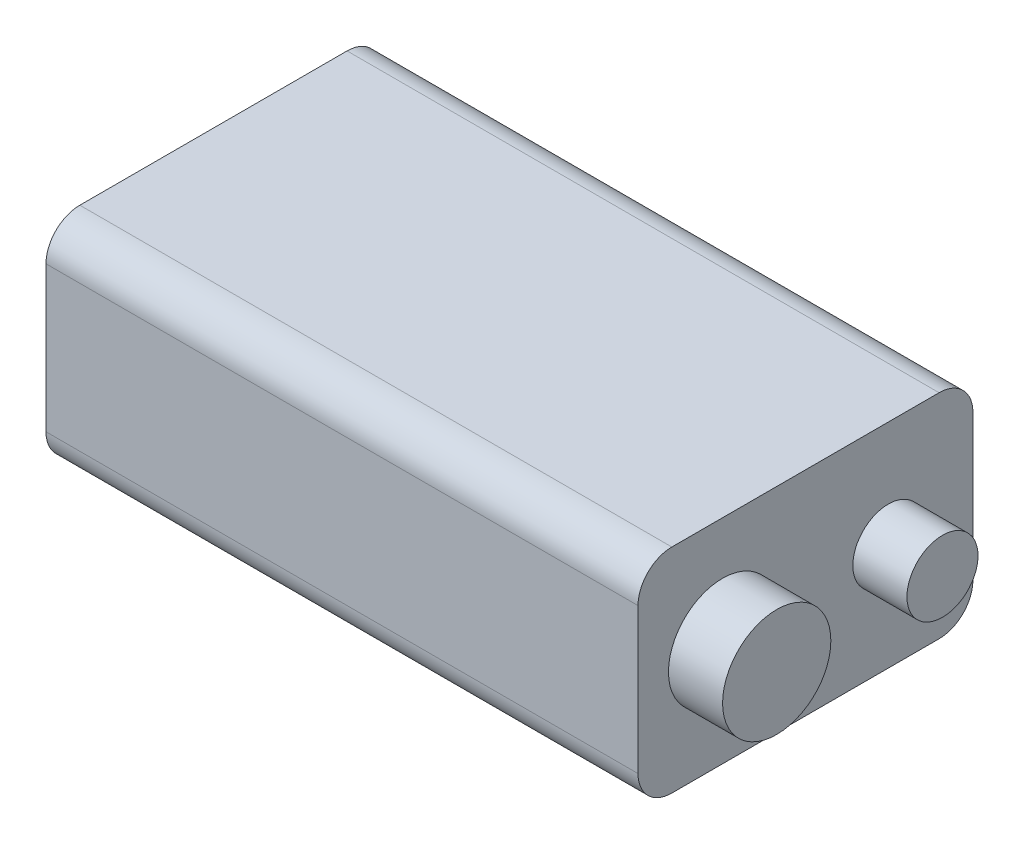
ISO-10303-21;
HEADER;
FILE_DESCRIPTION(('STEP AP214'),'2;1');
FILE_NAME('part.step','',(''),(''),'','','');
FILE_SCHEMA(('AUTOMOTIVE_DESIGN { 1 0 10303 214 1 1 1 1 }'));
ENDSEC;
DATA;
#1=APPLICATION_CONTEXT('core data for automotive mechanical design processes');
#2=APPLICATION_PROTOCOL_DEFINITION('international standard','automotive_design',2000,#1);
#3=PRODUCT_CONTEXT('',#1,'mechanical');
#4=PRODUCT('Part','Part','',(#3));
#5=PRODUCT_RELATED_PRODUCT_CATEGORY('part','',(#4));
#6=PRODUCT_DEFINITION_FORMATION('','',#4);
#7=PRODUCT_DEFINITION_CONTEXT('part definition',#1,'design');
#8=PRODUCT_DEFINITION('design','',#6,#7);
#9=PRODUCT_DEFINITION_SHAPE('','',#8);
#10=(LENGTH_UNIT() NAMED_UNIT(*) SI_UNIT(.MILLI.,.METRE.));
#11=(NAMED_UNIT(*) PLANE_ANGLE_UNIT() SI_UNIT($,.RADIAN.));
#12=(NAMED_UNIT(*) SI_UNIT($,.STERADIAN.) SOLID_ANGLE_UNIT());
#13=UNCERTAINTY_MEASURE_WITH_UNIT(LENGTH_MEASURE(1.E-05),#10,'distance_accuracy_value','');
#14=(GEOMETRIC_REPRESENTATION_CONTEXT(3) GLOBAL_UNCERTAINTY_ASSIGNED_CONTEXT((#13)) GLOBAL_UNIT_ASSIGNED_CONTEXT((#10,
#11,#12)) REPRESENTATION_CONTEXT('',''));
#15=CARTESIAN_POINT('',(0.,0.,0.));
#16=DIRECTION('',(0.,0.,1.));
#17=DIRECTION('',(1.,0.,0.));
#18=AXIS2_PLACEMENT_3D('',#15,#16,#17);
#19=CARTESIAN_POINT('',(22.225,16.002,-12.573));
#20=DIRECTION('',(-1.,0.,0.));
#21=DIRECTION('',(0.,0.,1.));
#22=AXIS2_PLACEMENT_3D('',#19,#20,#21);
#23=PLANE('',#22);
#24=CARTESIAN_POINT('',(22.225,8.001,-6.223));
#25=DIRECTION('',(-1.,0.,0.));
#26=DIRECTION('',(0.,0.,1.));
#27=AXIS2_PLACEMENT_3D('',#24,#25,#26);
#28=CIRCLE('',#27,2.667);
#29=CARTESIAN_POINT('',(22.225,8.001,-3.556));
#30=VERTEX_POINT('',#29);
#31=EDGE_CURVE('E11',#30,#30,#28,.F.);
#32=ORIENTED_EDGE('',*,*,#31,.F.);
#33=EDGE_LOOP('',(#32));
#34=FACE_BOUND('',#33,.T.);
#35=CARTESIAN_POINT('',(22.225,8.001,6.223));
#36=DIRECTION('',(-1.,0.,0.));
#37=DIRECTION('',(0.,0.,1.));
#38=AXIS2_PLACEMENT_3D('',#35,#36,#37);
#39=CIRCLE('',#38,4.064);
#40=CARTESIAN_POINT('',(22.225,8.001,10.287));
#41=VERTEX_POINT('',#40);
#42=EDGE_CURVE('E41',#41,#41,#39,.F.);
#43=ORIENTED_EDGE('',*,*,#42,.F.);
#44=EDGE_LOOP('',(#43));
#45=FACE_BOUND('',#44,.T.);
#46=DIRECTION('',(0.,0.,-1.));
#47=VECTOR('',#46,1.);
#48=CARTESIAN_POINT('',(22.225,0.,-12.573));
#49=LINE('',#48,#47);
#50=CARTESIAN_POINT('',(22.225,0.,10.033));
#51=VERTEX_POINT('',#50);
#52=CARTESIAN_POINT('',(22.225,0.,-10.033));
#53=VERTEX_POINT('',#52);
#54=EDGE_CURVE('E162',#51,#53,#49,.T.);
#55=ORIENTED_EDGE('',*,*,#54,.T.);
#56=CARTESIAN_POINT('',(22.225,2.54,-10.033));
#57=DIRECTION('',(-1.,0.,0.));
#58=DIRECTION('',(0.,0.,1.));
#59=AXIS2_PLACEMENT_3D('',#56,#57,#58);
#60=CIRCLE('',#59,2.54);
#61=CARTESIAN_POINT('',(22.225,2.54,-12.573));
#62=VERTEX_POINT('',#61);
#63=EDGE_CURVE('E142',#53,#62,#60,.F.);
#64=ORIENTED_EDGE('',*,*,#63,.T.);
#65=DIRECTION('',(0.,-1.,0.));
#66=VECTOR('',#65,1.);
#67=CARTESIAN_POINT('',(22.225,16.002,-12.573));
#68=LINE('',#67,#66);
#69=CARTESIAN_POINT('',(22.225,13.462,-12.573));
#70=VERTEX_POINT('',#69);
#71=EDGE_CURVE('E121',#70,#62,#68,.T.);
#72=ORIENTED_EDGE('',*,*,#71,.F.);
#73=CARTESIAN_POINT('',(22.225,13.462,-10.033));
#74=DIRECTION('',(-1.,0.,0.));
#75=DIRECTION('',(0.,0.,1.));
#76=AXIS2_PLACEMENT_3D('',#73,#74,#75);
#77=CIRCLE('',#76,2.54);
#78=CARTESIAN_POINT('',(22.225,16.002,-10.033));
#79=VERTEX_POINT('',#78);
#80=EDGE_CURVE('E126',#70,#79,#77,.F.);
#81=ORIENTED_EDGE('',*,*,#80,.T.);
#82=DIRECTION('',(0.,0.,-1.));
#83=VECTOR('',#82,1.);
#84=CARTESIAN_POINT('',(22.225,16.002,-12.573));
#85=LINE('',#84,#83);
#86=CARTESIAN_POINT('',(22.225,16.002,10.033));
#87=VERTEX_POINT('',#86);
#88=EDGE_CURVE('E175',#87,#79,#85,.T.);
#89=ORIENTED_EDGE('',*,*,#88,.F.);
#90=CARTESIAN_POINT('',(22.225,13.462,10.033));
#91=DIRECTION('',(-1.,0.,0.));
#92=DIRECTION('',(0.,0.,1.));
#93=AXIS2_PLACEMENT_3D('',#90,#91,#92);
#94=CIRCLE('',#93,2.54);
#95=CARTESIAN_POINT('',(22.225,13.462,12.573));
#96=VERTEX_POINT('',#95);
#97=EDGE_CURVE('E56',#87,#96,#94,.F.);
#98=ORIENTED_EDGE('',*,*,#97,.T.);
#99=DIRECTION('',(0.,-1.,0.));
#100=VECTOR('',#99,1.);
#101=CARTESIAN_POINT('',(22.225,16.002,12.573));
#102=LINE('',#101,#100);
#103=CARTESIAN_POINT('',(22.225,2.54,12.573));
#104=VERTEX_POINT('',#103);
#105=EDGE_CURVE('E181',#96,#104,#102,.T.);
#106=ORIENTED_EDGE('',*,*,#105,.T.);
#107=CARTESIAN_POINT('',(22.225,2.54,10.033));
#108=DIRECTION('',(-1.,0.,0.));
#109=DIRECTION('',(0.,0.,1.));
#110=AXIS2_PLACEMENT_3D('',#107,#108,#109);
#111=CIRCLE('',#110,2.54);
#112=EDGE_CURVE('E48',#104,#51,#111,.F.);
#113=ORIENTED_EDGE('',*,*,#112,.T.);
#114=EDGE_LOOP('',(#55,#64,#72,#81,#89,#98,#106,#113));
#115=FACE_BOUND('',#114,.T.);
#116=ADVANCED_FACE('F33',(#34,#45,#115),#23,.F.);
#117=CARTESIAN_POINT('',(-22.225,16.002,-12.573));
#118=DIRECTION('',(0.,0.,1.));
#119=DIRECTION('',(1.,0.,0.));
#120=AXIS2_PLACEMENT_3D('',#117,#118,#119);
#121=PLANE('',#120);
#122=ORIENTED_EDGE('',*,*,#71,.T.);
#123=DIRECTION('',(-1.,0.,0.));
#124=VECTOR('',#123,1.);
#125=CARTESIAN_POINT('',(-22.225,2.54,-12.573));
#126=LINE('',#125,#124);
#127=CARTESIAN_POINT('',(-22.225,2.54,-12.573));
#128=VERTEX_POINT('',#127);
#129=EDGE_CURVE('E120',#62,#128,#126,.T.);
#130=ORIENTED_EDGE('',*,*,#129,.T.);
#131=DIRECTION('',(0.,-1.,0.));
#132=VECTOR('',#131,1.);
#133=CARTESIAN_POINT('',(-22.225,16.002,-12.573));
#134=LINE('',#133,#132);
#135=CARTESIAN_POINT('',(-22.225,13.462,-12.573));
#136=VERTEX_POINT('',#135);
#137=EDGE_CURVE('E103',#136,#128,#134,.T.);
#138=ORIENTED_EDGE('',*,*,#137,.F.);
#139=DIRECTION('',(-1.,0.,0.));
#140=VECTOR('',#139,1.);
#141=CARTESIAN_POINT('',(22.225,13.462,-12.573));
#142=LINE('',#141,#140);
#143=EDGE_CURVE('E117',#136,#70,#142,.F.);
#144=ORIENTED_EDGE('',*,*,#143,.T.);
#145=EDGE_LOOP('',(#122,#130,#138,#144));
#146=FACE_BOUND('',#145,.T.);
#147=ADVANCED_FACE('F116',(#146),#121,.F.);
#148=CARTESIAN_POINT('',(-22.225,16.002,-12.573));
#149=DIRECTION('',(1.,0.,0.));
#150=DIRECTION('',(0.,0.,-1.));
#151=AXIS2_PLACEMENT_3D('',#148,#149,#150);
#152=PLANE('',#151);
#153=ORIENTED_EDGE('',*,*,#137,.T.);
#154=CARTESIAN_POINT('',(-22.225,2.54,-10.033));
#155=DIRECTION('',(1.,0.,0.));
#156=DIRECTION('',(0.,0.,-1.));
#157=AXIS2_PLACEMENT_3D('',#154,#155,#156);
#158=CIRCLE('',#157,2.54);
#159=CARTESIAN_POINT('',(-22.225,0.,-10.033));
#160=VERTEX_POINT('',#159);
#161=EDGE_CURVE('E133',#128,#160,#158,.F.);
#162=ORIENTED_EDGE('',*,*,#161,.T.);
#163=DIRECTION('',(0.,0.,1.));
#164=VECTOR('',#163,1.);
#165=CARTESIAN_POINT('',(-22.225,0.,-12.573));
#166=LINE('',#165,#164);
#167=CARTESIAN_POINT('',(-22.225,0.,10.033));
#168=VERTEX_POINT('',#167);
#169=EDGE_CURVE('E165',#160,#168,#166,.T.);
#170=ORIENTED_EDGE('',*,*,#169,.T.);
#171=CARTESIAN_POINT('',(-22.225,2.54,10.033));
#172=DIRECTION('',(1.,0.,0.));
#173=DIRECTION('',(0.,0.,-1.));
#174=AXIS2_PLACEMENT_3D('',#171,#172,#173);
#175=CIRCLE('',#174,2.54);
#176=CARTESIAN_POINT('',(-22.225,2.54,12.573));
#177=VERTEX_POINT('',#176);
#178=EDGE_CURVE('E110',#168,#177,#175,.F.);
#179=ORIENTED_EDGE('',*,*,#178,.T.);
#180=DIRECTION('',(0.,-1.,0.));
#181=VECTOR('',#180,1.);
#182=CARTESIAN_POINT('',(-22.225,16.002,12.573));
#183=LINE('',#182,#181);
#184=CARTESIAN_POINT('',(-22.225,13.462,12.573));
#185=VERTEX_POINT('',#184);
#186=EDGE_CURVE('E122',#185,#177,#183,.T.);
#187=ORIENTED_EDGE('',*,*,#186,.F.);
#188=CARTESIAN_POINT('',(-22.225,13.462,10.033));
#189=DIRECTION('',(1.,0.,0.));
#190=DIRECTION('',(0.,0.,-1.));
#191=AXIS2_PLACEMENT_3D('',#188,#189,#190);
#192=CIRCLE('',#191,2.54);
#193=CARTESIAN_POINT('',(-22.225,16.002,10.033));
#194=VERTEX_POINT('',#193);
#195=EDGE_CURVE('E111',#185,#194,#192,.F.);
#196=ORIENTED_EDGE('',*,*,#195,.T.);
#197=DIRECTION('',(0.,0.,1.));
#198=VECTOR('',#197,1.);
#199=CARTESIAN_POINT('',(-22.225,16.002,-12.573));
#200=LINE('',#199,#198);
#201=CARTESIAN_POINT('',(-22.225,16.002,-10.033));
#202=VERTEX_POINT('',#201);
#203=EDGE_CURVE('E105',#202,#194,#200,.T.);
#204=ORIENTED_EDGE('',*,*,#203,.F.);
#205=CARTESIAN_POINT('',(-22.225,13.462,-10.033));
#206=DIRECTION('',(1.,0.,0.));
#207=DIRECTION('',(0.,0.,-1.));
#208=AXIS2_PLACEMENT_3D('',#205,#206,#207);
#209=CIRCLE('',#208,2.54);
#210=EDGE_CURVE('E100',#202,#136,#209,.F.);
#211=ORIENTED_EDGE('',*,*,#210,.T.);
#212=EDGE_LOOP('',(#153,#162,#170,#179,#187,#196,#204,#211));
#213=FACE_BOUND('',#212,.T.);
#214=ADVANCED_FACE('F102',(#213),#152,.F.);
#215=CARTESIAN_POINT('',(-22.225,16.002,12.573));
#216=DIRECTION('',(0.,0.,-1.));
#217=DIRECTION('',(-1.,0.,0.));
#218=AXIS2_PLACEMENT_3D('',#215,#216,#217);
#219=PLANE('',#218);
#220=ORIENTED_EDGE('',*,*,#186,.T.);
#221=DIRECTION('',(1.,0.,0.));
#222=VECTOR('',#221,1.);
#223=CARTESIAN_POINT('',(-22.225,2.54,12.573));
#224=LINE('',#223,#222);
#225=EDGE_CURVE('E146',#177,#104,#224,.T.);
#226=ORIENTED_EDGE('',*,*,#225,.T.);
#227=ORIENTED_EDGE('',*,*,#105,.F.);
#228=DIRECTION('',(1.,0.,0.));
#229=VECTOR('',#228,1.);
#230=CARTESIAN_POINT('',(-22.225,13.462,12.573));
#231=LINE('',#230,#229);
#232=EDGE_CURVE('E144',#96,#185,#231,.F.);
#233=ORIENTED_EDGE('',*,*,#232,.T.);
#234=EDGE_LOOP('',(#220,#226,#227,#233));
#235=FACE_BOUND('',#234,.T.);
#236=ADVANCED_FACE('F186',(#235),#219,.F.);
#237=CARTESIAN_POINT('',(0.,16.002,0.));
#238=DIRECTION('',(0.,1.,0.));
#239=DIRECTION('',(0.,0.,1.));
#240=AXIS2_PLACEMENT_3D('',#237,#238,#239);
#241=PLANE('',#240);
#242=ORIENTED_EDGE('',*,*,#88,.T.);
#243=DIRECTION('',(-1.,0.,0.));
#244=VECTOR('',#243,1.);
#245=CARTESIAN_POINT('',(-22.225,16.002,-10.033));
#246=LINE('',#245,#244);
#247=EDGE_CURVE('E151',#79,#202,#246,.T.);
#248=ORIENTED_EDGE('',*,*,#247,.T.);
#249=ORIENTED_EDGE('',*,*,#203,.T.);
#250=DIRECTION('',(1.,0.,0.));
#251=VECTOR('',#250,1.);
#252=CARTESIAN_POINT('',(22.225,16.002,10.033));
#253=LINE('',#252,#251);
#254=EDGE_CURVE('E148',#194,#87,#253,.T.);
#255=ORIENTED_EDGE('',*,*,#254,.T.);
#256=EDGE_LOOP('',(#242,#248,#249,#255));
#257=FACE_BOUND('',#256,.T.);
#258=ADVANCED_FACE('F204',(#257),#241,.T.);
#259=CARTESIAN_POINT('',(0.,0.,0.));
#260=DIRECTION('',(0.,1.,0.));
#261=DIRECTION('',(0.,0.,1.));
#262=AXIS2_PLACEMENT_3D('',#259,#260,#261);
#263=PLANE('',#262);
#264=ORIENTED_EDGE('',*,*,#169,.F.);
#265=DIRECTION('',(-1.,0.,0.));
#266=VECTOR('',#265,1.);
#267=CARTESIAN_POINT('',(0.,0.,-10.033));
#268=LINE('',#267,#266);
#269=EDGE_CURVE('E137',#160,#53,#268,.F.);
#270=ORIENTED_EDGE('',*,*,#269,.T.);
#271=ORIENTED_EDGE('',*,*,#54,.F.);
#272=DIRECTION('',(1.,0.,0.));
#273=VECTOR('',#272,1.);
#274=CARTESIAN_POINT('',(0.,0.,10.033));
#275=LINE('',#274,#273);
#276=EDGE_CURVE('E135',#51,#168,#275,.F.);
#277=ORIENTED_EDGE('',*,*,#276,.T.);
#278=EDGE_LOOP('',(#264,#270,#271,#277));
#279=FACE_BOUND('',#278,.T.);
#280=ADVANCED_FACE('F174',(#279),#263,.F.);
#281=CARTESIAN_POINT('',(-22.225,2.54,-10.033));
#282=DIRECTION('',(-1.,0.,0.));
#283=DIRECTION('',(0.,0.,1.));
#284=AXIS2_PLACEMENT_3D('',#281,#282,#283);
#285=CYLINDRICAL_SURFACE('',#284,2.54);
#286=ORIENTED_EDGE('',*,*,#63,.F.);
#287=ORIENTED_EDGE('',*,*,#269,.F.);
#288=ORIENTED_EDGE('',*,*,#161,.F.);
#289=ORIENTED_EDGE('',*,*,#129,.F.);
#290=EDGE_LOOP('',(#286,#287,#288,#289));
#291=FACE_BOUND('',#290,.T.);
#292=ADVANCED_FACE('F170',(#291),#285,.T.);
#293=CARTESIAN_POINT('',(-22.225,2.54,10.033));
#294=DIRECTION('',(1.,0.,0.));
#295=DIRECTION('',(0.,0.,-1.));
#296=AXIS2_PLACEMENT_3D('',#293,#294,#295);
#297=CYLINDRICAL_SURFACE('',#296,2.54);
#298=ORIENTED_EDGE('',*,*,#178,.F.);
#299=ORIENTED_EDGE('',*,*,#276,.F.);
#300=ORIENTED_EDGE('',*,*,#112,.F.);
#301=ORIENTED_EDGE('',*,*,#225,.F.);
#302=EDGE_LOOP('',(#298,#299,#300,#301));
#303=FACE_BOUND('',#302,.T.);
#304=ADVANCED_FACE('F189',(#303),#297,.T.);
#305=CARTESIAN_POINT('',(0.,13.462,-10.033));
#306=DIRECTION('',(1.,0.,0.));
#307=DIRECTION('',(0.,0.,-1.));
#308=AXIS2_PLACEMENT_3D('',#305,#306,#307);
#309=CYLINDRICAL_SURFACE('',#308,2.54);
#310=ORIENTED_EDGE('',*,*,#80,.F.);
#311=ORIENTED_EDGE('',*,*,#143,.F.);
#312=ORIENTED_EDGE('',*,*,#210,.F.);
#313=ORIENTED_EDGE('',*,*,#247,.F.);
#314=EDGE_LOOP('',(#310,#311,#312,#313));
#315=FACE_BOUND('',#314,.T.);
#316=ADVANCED_FACE('F125',(#315),#309,.T.);
#317=CARTESIAN_POINT('',(0.,13.462,10.033));
#318=DIRECTION('',(-1.,0.,0.));
#319=DIRECTION('',(0.,0.,1.));
#320=AXIS2_PLACEMENT_3D('',#317,#318,#319);
#321=CYLINDRICAL_SURFACE('',#320,2.54);
#322=ORIENTED_EDGE('',*,*,#195,.F.);
#323=ORIENTED_EDGE('',*,*,#232,.F.);
#324=ORIENTED_EDGE('',*,*,#97,.F.);
#325=ORIENTED_EDGE('',*,*,#254,.F.);
#326=EDGE_LOOP('',(#322,#323,#324,#325));
#327=FACE_BOUND('',#326,.T.);
#328=ADVANCED_FACE('F35',(#327),#321,.T.);
#329=CARTESIAN_POINT('',(26.289,8.001,6.223));
#330=DIRECTION('',(-1.,0.,0.));
#331=DIRECTION('',(0.,0.,1.));
#332=AXIS2_PLACEMENT_3D('',#329,#330,#331);
#333=CYLINDRICAL_SURFACE('',#332,4.064);
#334=CARTESIAN_POINT('',(26.289,8.001,6.223));
#335=DIRECTION('',(1.,0.,0.));
#336=DIRECTION('',(0.,0.,-1.));
#337=AXIS2_PLACEMENT_3D('',#334,#335,#336);
#338=CIRCLE('',#337,4.064);
#339=CARTESIAN_POINT('',(26.289,8.001,2.159));
#340=VERTEX_POINT('',#339);
#341=EDGE_CURVE('E166',#340,#340,#338,.T.);
#342=ORIENTED_EDGE('',*,*,#341,.F.);
#343=EDGE_LOOP('',(#342));
#344=FACE_BOUND('',#343,.T.);
#345=ORIENTED_EDGE('',*,*,#42,.T.);
#346=EDGE_LOOP('',(#345));
#347=FACE_BOUND('',#346,.T.);
#348=ADVANCED_FACE('F155',(#344,#347),#333,.T.);
#349=CARTESIAN_POINT('',(26.289,8.001,6.223));
#350=DIRECTION('',(1.,0.,0.));
#351=DIRECTION('',(0.,0.,-1.));
#352=AXIS2_PLACEMENT_3D('',#349,#350,#351);
#353=PLANE('',#352);
#354=ORIENTED_EDGE('',*,*,#341,.T.);
#355=EDGE_LOOP('',(#354));
#356=FACE_BOUND('',#355,.T.);
#357=ADVANCED_FACE('F212',(#356),#353,.T.);
#358=CARTESIAN_POINT('',(26.289,8.001,-6.223));
#359=DIRECTION('',(-1.,0.,0.));
#360=DIRECTION('',(0.,0.,1.));
#361=AXIS2_PLACEMENT_3D('',#358,#359,#360);
#362=CYLINDRICAL_SURFACE('',#361,2.667);
#363=CARTESIAN_POINT('',(26.289,8.001,-6.223));
#364=DIRECTION('',(1.,0.,0.));
#365=DIRECTION('',(0.,0.,-1.));
#366=AXIS2_PLACEMENT_3D('',#363,#364,#365);
#367=CIRCLE('',#366,2.667);
#368=CARTESIAN_POINT('',(26.289,8.001,-8.89));
#369=VERTEX_POINT('',#368);
#370=EDGE_CURVE('E228',#369,#369,#367,.T.);
#371=ORIENTED_EDGE('',*,*,#370,.F.);
#372=EDGE_LOOP('',(#371));
#373=FACE_BOUND('',#372,.T.);
#374=ORIENTED_EDGE('',*,*,#31,.T.);
#375=EDGE_LOOP('',(#374));
#376=FACE_BOUND('',#375,.T.);
#377=ADVANCED_FACE('F216',(#373,#376),#362,.T.);
#378=CARTESIAN_POINT('',(26.289,8.001,-6.223));
#379=DIRECTION('',(1.,0.,0.));
#380=DIRECTION('',(0.,0.,-1.));
#381=AXIS2_PLACEMENT_3D('',#378,#379,#380);
#382=PLANE('',#381);
#383=ORIENTED_EDGE('',*,*,#370,.T.);
#384=EDGE_LOOP('',(#383));
#385=FACE_BOUND('',#384,.T.);
#386=ADVANCED_FACE('F220',(#385),#382,.T.);
#387=CLOSED_SHELL('',(#116,#147,#214,#236,#258,#280,#292,#304,#316,#328,#348,#357,#377,#386));
#388=MANIFOLD_SOLID_BREP('B2',#387);
#389=ADVANCED_BREP_SHAPE_REPRESENTATION('',(#18,#388),#14);
#390=SHAPE_DEFINITION_REPRESENTATION(#9,#389);
ENDSEC;
END-ISO-10303-21;
